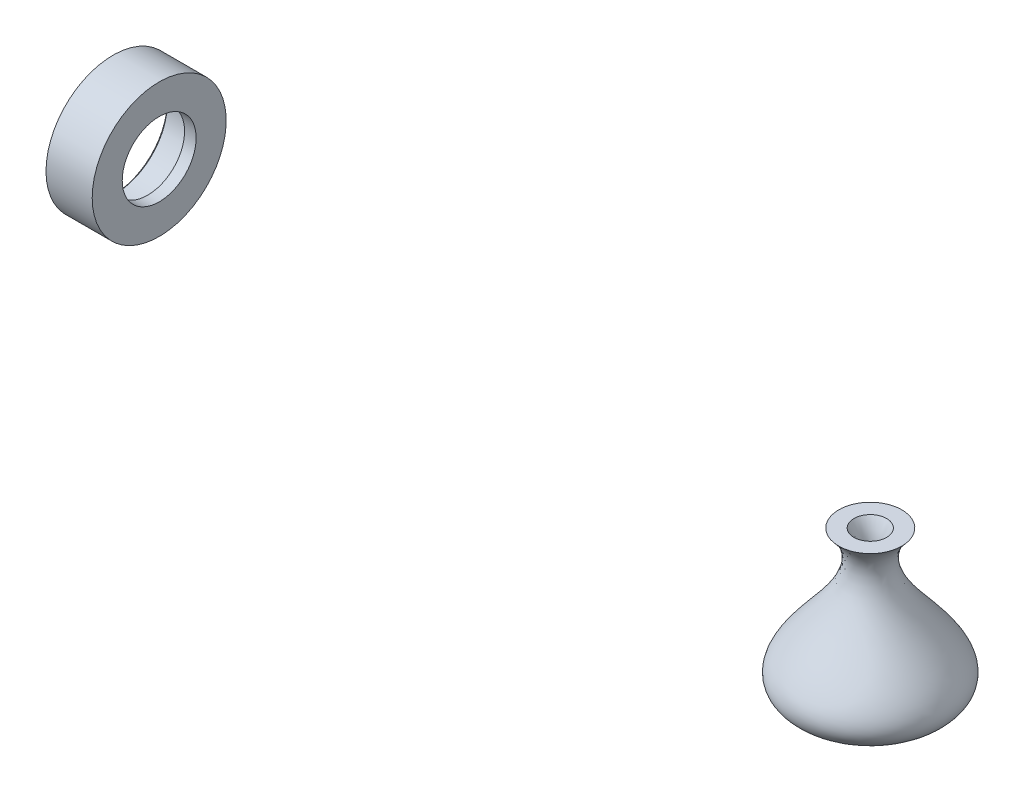
ISO-10303-21;
HEADER;
FILE_DESCRIPTION(('STEP AP214'),'2;1');
FILE_NAME('part.step','',(''),(''),'','','');
FILE_SCHEMA(('AUTOMOTIVE_DESIGN { 1 0 10303 214 1 1 1 1 }'));
ENDSEC;
DATA;
#1=APPLICATION_CONTEXT('core data for automotive mechanical design processes');
#2=APPLICATION_PROTOCOL_DEFINITION('international standard','automotive_design',2000,#1);
#3=PRODUCT_CONTEXT('',#1,'mechanical');
#4=PRODUCT('Part','Part','',(#3));
#5=PRODUCT_RELATED_PRODUCT_CATEGORY('part','',(#4));
#6=PRODUCT_DEFINITION_FORMATION('','',#4);
#7=PRODUCT_DEFINITION_CONTEXT('part definition',#1,'design');
#8=PRODUCT_DEFINITION('design','',#6,#7);
#9=PRODUCT_DEFINITION_SHAPE('','',#8);
#10=(LENGTH_UNIT() NAMED_UNIT(*) SI_UNIT(.MILLI.,.METRE.));
#11=(NAMED_UNIT(*) PLANE_ANGLE_UNIT() SI_UNIT($,.RADIAN.));
#12=(NAMED_UNIT(*) SI_UNIT($,.STERADIAN.) SOLID_ANGLE_UNIT());
#13=UNCERTAINTY_MEASURE_WITH_UNIT(LENGTH_MEASURE(1.E-05),#10,'distance_accuracy_value','');
#14=(GEOMETRIC_REPRESENTATION_CONTEXT(3) GLOBAL_UNCERTAINTY_ASSIGNED_CONTEXT((#13)) GLOBAL_UNIT_ASSIGNED_CONTEXT((#10,
#11,#12)) REPRESENTATION_CONTEXT('',''));
#15=CARTESIAN_POINT('',(0.,0.,0.));
#16=DIRECTION('',(0.,0.,1.));
#17=DIRECTION('',(1.,0.,0.));
#18=AXIS2_PLACEMENT_3D('',#15,#16,#17);
#19=CARTESIAN_POINT('',(-386.410262995136,30.1996633255184,0.));
#20=DIRECTION('',(-1.,0.,0.));
#21=DIRECTION('',(0.,0.,1.));
#22=AXIS2_PLACEMENT_3D('',#19,#20,#21);
#23=CYLINDRICAL_SURFACE('',#22,22.5);
#24=CARTESIAN_POINT('',(-339.80509567285,30.1996633255184,0.));
#25=DIRECTION('',(-1.,0.,0.));
#26=DIRECTION('',(0.,0.,1.));
#27=AXIS2_PLACEMENT_3D('',#24,#25,#26);
#28=CIRCLE('',#27,22.5);
#29=CARTESIAN_POINT('',(-339.80509567285,30.1996633255184,22.5));
#30=VERTEX_POINT('',#29);
#31=EDGE_CURVE('E50',#30,#30,#28,.T.);
#32=ORIENTED_EDGE('',*,*,#31,.T.);
#33=EDGE_LOOP('',(#32));
#34=FACE_BOUND('',#33,.T.);
#35=CARTESIAN_POINT('',(-328.80509567285,30.1996633255184,0.));
#36=DIRECTION('',(-1.,0.,0.));
#37=DIRECTION('',(0.,0.,1.));
#38=AXIS2_PLACEMENT_3D('',#35,#36,#37);
#39=CIRCLE('',#38,22.5);
#40=CARTESIAN_POINT('',(-328.80509567285,30.1996633255184,22.5));
#41=VERTEX_POINT('',#40);
#42=EDGE_CURVE('E54',#41,#41,#39,.T.);
#43=ORIENTED_EDGE('',*,*,#42,.F.);
#44=EDGE_LOOP('',(#43));
#45=FACE_BOUND('',#44,.T.);
#46=ADVANCED_FACE('F43',(#34,#45),#23,.F.);
#47=CARTESIAN_POINT('',(-328.80509567285,0.,0.));
#48=DIRECTION('',(-1.,0.,0.));
#49=DIRECTION('',(0.,0.,1.));
#50=AXIS2_PLACEMENT_3D('',#47,#48,#49);
#51=PLANE('',#50);
#52=CARTESIAN_POINT('',(-328.80509567285,30.1996633255184,0.));
#53=DIRECTION('',(-1.,0.,0.));
#54=DIRECTION('',(0.,0.,1.));
#55=AXIS2_PLACEMENT_3D('',#52,#53,#54);
#56=CIRCLE('',#55,25.);
#57=CARTESIAN_POINT('',(-328.80509567285,30.1996633255184,25.));
#58=VERTEX_POINT('',#57);
#59=EDGE_CURVE('E58',#58,#58,#56,.T.);
#60=ORIENTED_EDGE('',*,*,#59,.F.);
#61=EDGE_LOOP('',(#60));
#62=FACE_BOUND('',#61,.T.);
#63=ORIENTED_EDGE('',*,*,#42,.T.);
#64=EDGE_LOOP('',(#63));
#65=FACE_BOUND('',#64,.T.);
#66=ADVANCED_FACE('F95',(#62,#65),#51,.F.);
#67=CARTESIAN_POINT('',(-386.410262995136,30.1996633255184,0.));
#68=DIRECTION('',(-1.,0.,0.));
#69=DIRECTION('',(0.,0.,1.));
#70=AXIS2_PLACEMENT_3D('',#67,#68,#69);
#71=CYLINDRICAL_SURFACE('',#70,25.);
#72=CARTESIAN_POINT('',(-325.80509567285,30.1996633255184,0.));
#73=DIRECTION('',(-1.,0.,0.));
#74=DIRECTION('',(0.,0.,1.));
#75=AXIS2_PLACEMENT_3D('',#72,#73,#74);
#76=CIRCLE('',#75,25.);
#77=CARTESIAN_POINT('',(-325.80509567285,30.1996633255184,25.));
#78=VERTEX_POINT('',#77);
#79=EDGE_CURVE('E63',#78,#78,#76,.T.);
#80=ORIENTED_EDGE('',*,*,#79,.F.);
#81=EDGE_LOOP('',(#80));
#82=FACE_BOUND('',#81,.T.);
#83=ORIENTED_EDGE('',*,*,#59,.T.);
#84=EDGE_LOOP('',(#83));
#85=FACE_BOUND('',#84,.T.);
#86=ADVANCED_FACE('F99',(#82,#85),#71,.F.);
#87=CARTESIAN_POINT('',(-325.80509567285,0.,0.));
#88=DIRECTION('',(1.,0.,0.));
#89=DIRECTION('',(0.,0.,-1.));
#90=AXIS2_PLACEMENT_3D('',#87,#88,#89);
#91=PLANE('',#90);
#92=CARTESIAN_POINT('',(-325.80509567285,30.1996633255184,0.));
#93=DIRECTION('',(-1.,0.,0.));
#94=DIRECTION('',(0.,0.,1.));
#95=AXIS2_PLACEMENT_3D('',#92,#93,#94);
#96=CIRCLE('',#95,16.);
#97=CARTESIAN_POINT('',(-325.80509567285,30.1996633255184,16.));
#98=VERTEX_POINT('',#97);
#99=EDGE_CURVE('E66',#98,#98,#96,.T.);
#100=ORIENTED_EDGE('',*,*,#99,.F.);
#101=EDGE_LOOP('',(#100));
#102=FACE_BOUND('',#101,.T.);
#103=ORIENTED_EDGE('',*,*,#79,.T.);
#104=EDGE_LOOP('',(#103));
#105=FACE_BOUND('',#104,.T.);
#106=ADVANCED_FACE('F106',(#102,#105),#91,.F.);
#107=CARTESIAN_POINT('',(-386.410262995136,30.1996633255184,0.));
#108=DIRECTION('',(-1.,0.,0.));
#109=DIRECTION('',(0.,0.,1.));
#110=AXIS2_PLACEMENT_3D('',#107,#108,#109);
#111=CYLINDRICAL_SURFACE('',#110,16.);
#112=CARTESIAN_POINT('',(-320.80509567285,30.1996633255184,0.));
#113=DIRECTION('',(-1.,0.,0.));
#114=DIRECTION('',(0.,0.,1.));
#115=AXIS2_PLACEMENT_3D('',#112,#113,#114);
#116=CIRCLE('',#115,16.);
#117=CARTESIAN_POINT('',(-320.80509567285,30.1996633255184,16.));
#118=VERTEX_POINT('',#117);
#119=EDGE_CURVE('E69',#118,#118,#116,.T.);
#120=ORIENTED_EDGE('',*,*,#119,.F.);
#121=EDGE_LOOP('',(#120));
#122=FACE_BOUND('',#121,.T.);
#123=ORIENTED_EDGE('',*,*,#99,.T.);
#124=EDGE_LOOP('',(#123));
#125=FACE_BOUND('',#124,.T.);
#126=ADVANCED_FACE('F91',(#122,#125),#111,.F.);
#127=CARTESIAN_POINT('',(-320.80509567285,0.,0.));
#128=DIRECTION('',(-1.,0.,0.));
#129=DIRECTION('',(0.,0.,1.));
#130=AXIS2_PLACEMENT_3D('',#127,#128,#129);
#131=PLANE('',#130);
#132=CARTESIAN_POINT('',(-320.80509567285,30.1996633255184,0.));
#133=DIRECTION('',(-1.,0.,0.));
#134=DIRECTION('',(0.,0.,1.));
#135=AXIS2_PLACEMENT_3D('',#132,#133,#134);
#136=CIRCLE('',#135,29.);
#137=CARTESIAN_POINT('',(-320.80509567285,30.1996633255184,29.));
#138=VERTEX_POINT('',#137);
#139=EDGE_CURVE('E72',#138,#138,#136,.T.);
#140=ORIENTED_EDGE('',*,*,#139,.F.);
#141=EDGE_LOOP('',(#140));
#142=FACE_BOUND('',#141,.T.);
#143=ORIENTED_EDGE('',*,*,#119,.T.);
#144=EDGE_LOOP('',(#143));
#145=FACE_BOUND('',#144,.T.);
#146=ADVANCED_FACE('F83',(#142,#145),#131,.F.);
#147=CARTESIAN_POINT('',(-386.410262995136,30.1996633255184,0.));
#148=DIRECTION('',(-1.,0.,0.));
#149=DIRECTION('',(0.,0.,1.));
#150=AXIS2_PLACEMENT_3D('',#147,#148,#149);
#151=CYLINDRICAL_SURFACE('',#150,29.);
#152=ORIENTED_EDGE('',*,*,#139,.T.);
#153=EDGE_LOOP('',(#152));
#154=FACE_BOUND('',#153,.T.);
#155=CARTESIAN_POINT('',(-340.80509567285,30.1996633255184,0.));
#156=DIRECTION('',(-1.,0.,0.));
#157=DIRECTION('',(0.,0.,1.));
#158=AXIS2_PLACEMENT_3D('',#155,#156,#157);
#159=CIRCLE('',#158,29.);
#160=CARTESIAN_POINT('',(-340.80509567285,30.1996633255184,29.));
#161=VERTEX_POINT('',#160);
#162=EDGE_CURVE('E75',#161,#161,#159,.T.);
#163=ORIENTED_EDGE('',*,*,#162,.F.);
#164=EDGE_LOOP('',(#163));
#165=FACE_BOUND('',#164,.T.);
#166=ADVANCED_FACE('F81',(#154,#165),#151,.T.);
#167=CARTESIAN_POINT('',(-340.80509567285,0.,0.));
#168=DIRECTION('',(-1.,0.,0.));
#169=DIRECTION('',(0.,0.,1.));
#170=AXIS2_PLACEMENT_3D('',#167,#168,#169);
#171=PLANE('',#170);
#172=CARTESIAN_POINT('',(-340.80509567285,30.1996633255184,0.));
#173=DIRECTION('',(-1.,0.,0.));
#174=DIRECTION('',(0.,0.,1.));
#175=AXIS2_PLACEMENT_3D('',#172,#173,#174);
#176=CIRCLE('',#175,23.5);
#177=CARTESIAN_POINT('',(-340.80509567285,30.1996633255184,23.5));
#178=VERTEX_POINT('',#177);
#179=EDGE_CURVE('E11',#178,#178,#176,.F.);
#180=ORIENTED_EDGE('',*,*,#179,.T.);
#181=EDGE_LOOP('',(#180));
#182=FACE_BOUND('',#181,.T.);
#183=ORIENTED_EDGE('',*,*,#162,.T.);
#184=EDGE_LOOP('',(#183));
#185=FACE_BOUND('',#184,.T.);
#186=ADVANCED_FACE('F79',(#182,#185),#171,.T.);
#187=CARTESIAN_POINT('',(-339.80509567285,30.1996633255184,0.));
#188=DIRECTION('',(-1.,0.,0.));
#189=DIRECTION('',(0.,0.,1.));
#190=AXIS2_PLACEMENT_3D('',#187,#188,#189);
#191=CONICAL_SURFACE('',#190,22.5,0.785398163397459);
#192=ORIENTED_EDGE('',*,*,#179,.F.);
#193=EDGE_LOOP('',(#192));
#194=FACE_BOUND('',#193,.T.);
#195=ORIENTED_EDGE('',*,*,#31,.F.);
#196=EDGE_LOOP('',(#195));
#197=FACE_BOUND('',#196,.T.);
#198=ADVANCED_FACE('F45',(#194,#197),#191,.F.);
#199=CLOSED_SHELL('',(#46,#66,#86,#106,#126,#146,#166,#186,#198));
#200=MANIFOLD_SOLID_BREP('B2',#199);
#201=CARTESIAN_POINT('',(0.,45.8770147429532,0.));
#202=DIRECTION('',(0.,1.,0.));
#203=DIRECTION('',(0.,0.,1.));
#204=AXIS2_PLACEMENT_3D('',#201,#202,#203);
#205=PLANE('',#204);
#206=CARTESIAN_POINT('',(-12.9652432969216,45.8770147429534,0.));
#207=DIRECTION('',(0.,-1.,0.));
#208=DIRECTION('',(0.,0.,-1.));
#209=AXIS2_PLACEMENT_3D('',#206,#207,#208);
#210=CIRCLE('',#209,7.08570297874684);
#211=CARTESIAN_POINT('',(-12.9652432969216,45.8770147429534,-7.08570297874684));
#212=VERTEX_POINT('',#211);
#213=EDGE_CURVE('E192',#212,#212,#210,.T.);
#214=ORIENTED_EDGE('',*,*,#213,.T.);
#215=EDGE_LOOP('',(#214));
#216=FACE_BOUND('',#215,.T.);
#217=CARTESIAN_POINT('',(-12.9652432969216,45.8770147429532,0.));
#218=DIRECTION('',(0.,-1.,0.));
#219=DIRECTION('',(0.,0.,-1.));
#220=AXIS2_PLACEMENT_3D('',#217,#218,#219);
#221=CIRCLE('',#220,13.6301275685586);
#222=CARTESIAN_POINT('',(-12.9652432969216,45.8770147429532,-13.6301275685586));
#223=VERTEX_POINT('',#222);
#224=EDGE_CURVE('E42',#223,#223,#221,.T.);
#225=ORIENTED_EDGE('',*,*,#224,.F.);
#226=EDGE_LOOP('',(#225));
#227=FACE_BOUND('',#226,.T.);
#228=ADVANCED_FACE('F182',(#216,#227),#205,.T.);
#229=CARTESIAN_POINT('',(-26.5953708654801,45.8770147429532,0.));
#230=CARTESIAN_POINT('',(-0.79666505967822,20.5804110405735,0.));
#231=CARTESIAN_POINT('',(-85.2461546673508,-11.0057017315045,0.));
#232=CARTESIAN_POINT('',(-21.7749598961118,-22.1074020319303,0.));
#233=B_SPLINE_CURVE_WITH_KNOTS('',3,(#229,#230,#231,#232),.UNSPECIFIED.,.F.,.F.,(4,4),(0.,1.),.UNSPECIFIED.);
#234=CARTESIAN_POINT('',(-12.9652432969216,-22.1074020319303,0.));
#235=DIRECTION('',(0.,-1.,0.));
#236=AXIS1_PLACEMENT('',#234,#235);
#237=SURFACE_OF_REVOLUTION('',#233,#236);
#238=CARTESIAN_POINT('',(-12.9652432969216,-22.1074020319303,0.));
#239=DIRECTION('',(0.,-1.,0.));
#240=DIRECTION('',(0.,0.,-1.));
#241=AXIS2_PLACEMENT_3D('',#238,#239,#240);
#242=CIRCLE('',#241,8.80971659919028);
#243=CARTESIAN_POINT('',(-12.9652432969216,-22.1074020319303,-8.80971659919028));
#244=VERTEX_POINT('',#243);
#245=EDGE_CURVE('E188',#244,#244,#242,.T.);
#246=ORIENTED_EDGE('',*,*,#245,.F.);
#247=EDGE_LOOP('',(#246));
#248=FACE_BOUND('',#247,.T.);
#249=ORIENTED_EDGE('',*,*,#224,.T.);
#250=EDGE_LOOP('',(#249));
#251=FACE_BOUND('',#250,.T.);
#252=ADVANCED_FACE('F206',(#248,#251),#237,.T.);
#253=CARTESIAN_POINT('',(0.,-22.1074020319303,0.));
#254=DIRECTION('',(0.,1.,0.));
#255=DIRECTION('',(0.,0.,1.));
#256=AXIS2_PLACEMENT_3D('',#253,#254,#255);
#257=PLANE('',#256);
#258=ORIENTED_EDGE('',*,*,#245,.T.);
#259=EDGE_LOOP('',(#258));
#260=FACE_BOUND('',#259,.T.);
#261=ADVANCED_FACE('F209',(#260),#257,.F.);
#262=CARTESIAN_POINT('',(-23.0899523270799,49.4424096538488,0.));
#263=CARTESIAN_POINT('',(-23.068405837159,49.4212256147468,0.));
#264=CARTESIAN_POINT('',(-23.0445253928383,49.3977513809916,0.));
#265=CARTESIAN_POINT('',(-22.9922068829057,49.3461107039488,0.));
#266=CARTESIAN_POINT('',(-22.9644657105866,49.3186044203385,0.));
#267=CARTESIAN_POINT('',(-22.8858731284742,49.2403398275888,0.));
#268=CARTESIAN_POINT('',(-22.8351109612166,49.1894099312601,0.));
#269=CARTESIAN_POINT('',(-22.6798033564765,49.0323706356089,0.));
#270=CARTESIAN_POINT('',(-22.5772150734778,48.9270023494396,0.));
#271=CARTESIAN_POINT('',(-22.2704992113574,48.6068420535933,0.));
#272=CARTESIAN_POINT('',(-22.0682320750079,48.3888092510618,0.));
#273=CARTESIAN_POINT('',(-21.4692156490215,47.7202052133644,0.));
#274=CARTESIAN_POINT('',(-21.080170764951,47.2550740105174,0.));
#275=CARTESIAN_POINT('',(-19.9551932959032,45.7963509950921,0.));
#276=CARTESIAN_POINT('',(-19.260598275293,44.737581574198,0.));
#277=CARTESIAN_POINT('',(-18.0658820806875,42.448069868998,0.));
#278=CARTESIAN_POINT('',(-17.5680181561211,41.2164515425089,0.));
#279=CARTESIAN_POINT('',(-16.8518669311078,38.6533092967027,0.));
#280=CARTESIAN_POINT('',(-16.6354794890263,37.3246057753391,0.));
#281=CARTESIAN_POINT('',(-16.4901808441727,34.6921728936799,0.));
#282=CARTESIAN_POINT('',(-16.55925911903,33.3907671908307,0.));
#283=CARTESIAN_POINT('',(-16.911975849525,30.8912888162144,0.));
#284=CARTESIAN_POINT('',(-17.1937479602461,29.6923094562094,0.));
#285=CARTESIAN_POINT('',(-17.8931637239411,27.4071006164928,0.));
#286=CARTESIAN_POINT('',(-18.3106043770156,26.319742349233,0.));
#287=CARTESIAN_POINT('',(-19.2291240498077,24.2393877841288,0.));
#288=CARTESIAN_POINT('',(-19.7304786837473,23.2459599975399,0.));
#289=CARTESIAN_POINT('',(-21.3132841941126,20.3753817668029,0.));
#290=CARTESIAN_POINT('',(-22.4709241515752,18.6056691565151,0.));
#291=CARTESIAN_POINT('',(-24.8629280311426,15.2306227988018,0.));
#292=CARTESIAN_POINT('',(-26.0998626553567,13.6261502618269,0.));
#293=CARTESIAN_POINT('',(-28.5886314177561,10.5091950027977,0.));
#294=CARTESIAN_POINT('',(-29.8415524883474,8.99727127573256,0.));
#295=CARTESIAN_POINT('',(-32.3082913603747,6.0192141883621,0.));
#296=CARTESIAN_POINT('',(-33.5232838848226,4.55303706500729,0.));
#297=CARTESIAN_POINT('',(-35.2605179241552,2.36630147873446,0.));
#298=CARTESIAN_POINT('',(-35.8251456875937,1.63958797763293,0.));
#299=CARTESIAN_POINT('',(-36.9100933078852,0.189930887069639,0.));
#300=CARTESIAN_POINT('',(-37.4305440419276,-0.533162703072536,0.));
#301=CARTESIAN_POINT('',(-38.4043308774755,-1.97125423347526,0.));
#302=CARTESIAN_POINT('',(-38.8578255599255,-2.68665455295588,0.));
#303=CARTESIAN_POINT('',(-39.6627792942699,-4.09245613596053,0.));
#304=CARTESIAN_POINT('',(-40.0140124889391,-4.78370185034496,0.));
#305=CARTESIAN_POINT('',(-40.5658658877512,-6.09340115336082,0.));
#306=CARTESIAN_POINT('',(-40.7640555323906,-6.71139297737781,0.));
#307=CARTESIAN_POINT('',(-40.9249115798842,-7.51053993292039,0.));
#308=CARTESIAN_POINT('',(-40.9562909034249,-7.75503752705152,0.));
#309=CARTESIAN_POINT('',(-40.9808797877664,-8.19362591480926,0.));
#310=CARTESIAN_POINT('',(-40.9744604543321,-8.3873183336568,0.));
#311=CARTESIAN_POINT('',(-40.9336494780519,-8.73639066752239,0.));
#312=CARTESIAN_POINT('',(-40.8997620092929,-8.89232112693657,0.));
#313=CARTESIAN_POINT('',(-40.802536299394,-9.19855226306139,0.));
#314=CARTESIAN_POINT('',(-40.7387573994785,-9.34988203423126,0.));
#315=CARTESIAN_POINT('',(-40.5643478252837,-9.67216664420472,0.));
#316=CARTESIAN_POINT('',(-40.453097754047,-9.84303004560468,0.));
#317=CARTESIAN_POINT('',(-40.1707029875114,-10.2046867835445,0.));
#318=CARTESIAN_POINT('',(-39.9996099388627,-10.3949508201627,0.));
#319=CARTESIAN_POINT('',(-39.3984938819884,-10.9784975116262,0.));
#320=CARTESIAN_POINT('',(-38.8808267567641,-11.3817556977046,0.));
#321=CARTESIAN_POINT('',(-37.6881106128988,-12.1544904914729,0.));
#322=CARTESIAN_POINT('',(-37.0147178039795,-12.5250575524796,0.));
#323=CARTESIAN_POINT('',(-35.5762266073349,-13.2199868120436,0.));
#324=CARTESIAN_POINT('',(-34.8108125376579,-13.545081172321,0.));
#325=CARTESIAN_POINT('',(-33.2238779835391,-14.1528359116586,0.));
#326=CARTESIAN_POINT('',(-32.4020425983701,-14.4357156587131,0.));
#327=CARTESIAN_POINT('',(-29.8821877757814,-15.2301919342751,0.));
#328=CARTESIAN_POINT('',(-28.1315312057019,-15.6882893867926,0.));
#329=CARTESIAN_POINT('',(-25.4570226459879,-16.2999513483341,0.));
#330=CARTESIAN_POINT('',(-24.5568286391039,-16.4911373799938,0.));
#331=CARTESIAN_POINT('',(-23.1970907052258,-16.7617908191364,0.));
#332=CARTESIAN_POINT('',(-22.7422539782073,-16.8493141628529,0.));
#333=CARTESIAN_POINT('',(-22.0579426142396,-16.9768668216062,0.));
#334=CARTESIAN_POINT('',(-21.8295305314129,-17.0187552030392,0.));
#335=CARTESIAN_POINT('',(-21.4863154926972,-17.0807121517337,0.));
#336=CARTESIAN_POINT('',(-21.3720623747818,-17.1011698686751,0.));
#337=CARTESIAN_POINT('',(-21.1423615553453,-17.1419895789834,0.));
#338=CARTESIAN_POINT('',(-21.0306570484911,-17.1616339967606,0.));
#339=CARTESIAN_POINT('',(-20.9116081389498,-17.1825036833951,0.));
#340=B_SPLINE_CURVE_WITH_KNOTS('',3,(#262,#263,#264,#265,#266,#267,#268,#269,#270,#271,#272,
#273,#274,#275,#276,#277,#278,#279,#280,#281,#282,#283,#284,#285,#286,#287,#288,#289,#290,#291,
#292,#293,#294,#295,#296,#297,#298,#299,#300,#301,#302,#303,#304,#305,#306,#307,#308,#309,#310,
#311,#312,#313,#314,#315,#316,#317,#318,#319,#320,#321,#322,#323,#324,#325,#326,#327,#328,#329,
#330,#331,#332,#333,#334,#335,#336,#337,#338,#339),.UNSPECIFIED.,.F.,.F.,(4,2,2,2,2,2,2,2,2,2,2,
2,2,2,2,2,2,2,2,2,2,2,2,2,2,2,2,2,2,2,2,2,2,2,2,2,2,2,4),(0.,0.000976562500000036,
0.00195312500000007,0.00390625000000008,0.00781250000000003,0.015625,0.0312499999999999,
0.0624999999999999,0.0937499999999999,0.125,0.15625,0.1875,0.21875,0.25,0.3125,
0.374999999999999,0.437499999999999,0.499999999999999,0.531249999999999,0.562499999999999,
0.593749999999999,0.624999999999999,0.656249999999999,0.671875,0.687499999999999,
0.703124999999999,0.718749999999999,0.734374999999999,0.749999999999999,0.781249999999999,
0.812499999999999,0.84375,0.875,0.9375,0.96875,0.984375,0.9921875,0.99609375,1.),.UNSPECIFIED.);
#341=CARTESIAN_POINT('',(-12.9652432969216,-17.1074020319303,0.));
#342=DIRECTION('',(0.,-1.,0.));
#343=AXIS1_PLACEMENT('',#341,#342);
#344=SURFACE_OF_REVOLUTION('',#340,#343);
#345=CARTESIAN_POINT('',(-12.9652432969216,-17.1074020319303,0.));
#346=DIRECTION('',(0.,-1.,0.));
#347=DIRECTION('',(0.,0.,-1.));
#348=AXIS2_PLACEMENT_3D('',#345,#346,#347);
#349=CIRCLE('',#348,8.37160932620018);
#350=CARTESIAN_POINT('',(-12.9652432969216,-17.1074020319303,-8.37160932620018));
#351=VERTEX_POINT('',#350);
#352=EDGE_CURVE('E196',#351,#351,#349,.T.);
#353=ORIENTED_EDGE('',*,*,#352,.T.);
#354=EDGE_LOOP('',(#353));
#355=FACE_BOUND('',#354,.T.);
#356=ORIENTED_EDGE('',*,*,#213,.F.);
#357=EDGE_LOOP('',(#356));
#358=FACE_BOUND('',#357,.T.);
#359=ADVANCED_FACE('F213',(#355,#358),#344,.F.);
#360=CARTESIAN_POINT('',(0.,-17.1074020319303,0.));
#361=DIRECTION('',(0.,1.,0.));
#362=DIRECTION('',(0.,0.,1.));
#363=AXIS2_PLACEMENT_3D('',#360,#361,#362);
#364=PLANE('',#363);
#365=ORIENTED_EDGE('',*,*,#352,.F.);
#366=EDGE_LOOP('',(#365));
#367=FACE_BOUND('',#366,.T.);
#368=ADVANCED_FACE('F217',(#367),#364,.T.);
#369=CLOSED_SHELL('',(#228,#252,#261,#359,#368));
#370=MANIFOLD_SOLID_BREP('B6',#369);
#371=ADVANCED_BREP_SHAPE_REPRESENTATION('',(#18,#200,#370),#14);
#372=SHAPE_DEFINITION_REPRESENTATION(#9,#371);
ENDSEC;
END-ISO-10303-21;
